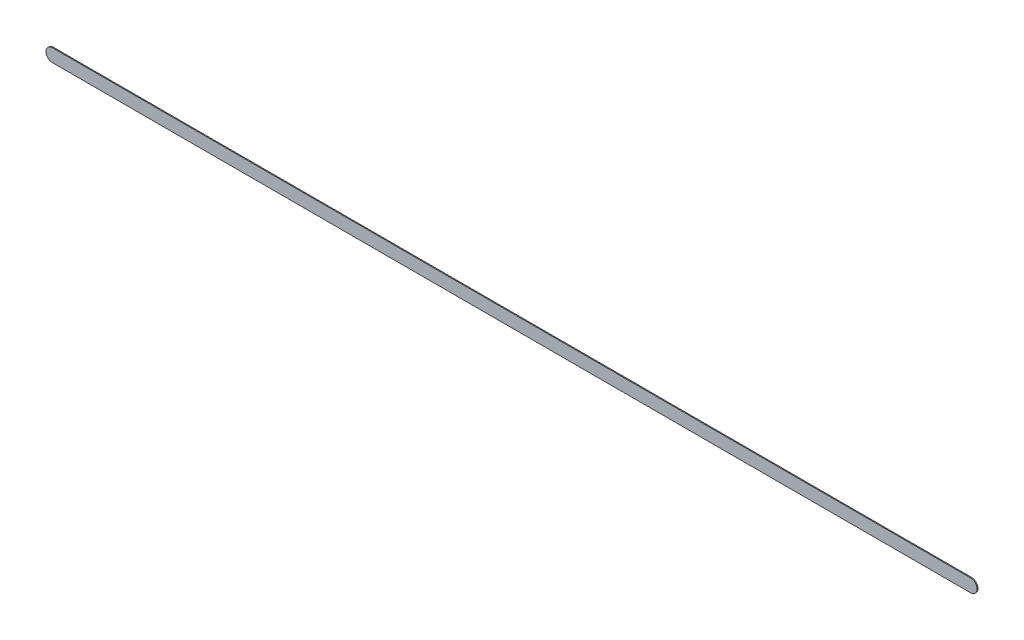
ISO-10303-21;
HEADER;
FILE_DESCRIPTION(('STEP AP214'),'2;1');
FILE_NAME('part.step','',(''),(''),'','','');
FILE_SCHEMA(('AUTOMOTIVE_DESIGN { 1 0 10303 214 1 1 1 1 }'));
ENDSEC;
DATA;
#1=APPLICATION_CONTEXT('core data for automotive mechanical design processes');
#2=APPLICATION_PROTOCOL_DEFINITION('international standard','automotive_design',2000,#1);
#3=PRODUCT_CONTEXT('',#1,'mechanical');
#4=PRODUCT('Part','Part','',(#3));
#5=PRODUCT_RELATED_PRODUCT_CATEGORY('part','',(#4));
#6=PRODUCT_DEFINITION_FORMATION('','',#4);
#7=PRODUCT_DEFINITION_CONTEXT('part definition',#1,'design');
#8=PRODUCT_DEFINITION('design','',#6,#7);
#9=PRODUCT_DEFINITION_SHAPE('','',#8);
#10=(LENGTH_UNIT() NAMED_UNIT(*) SI_UNIT(.MILLI.,.METRE.));
#11=(NAMED_UNIT(*) PLANE_ANGLE_UNIT() SI_UNIT($,.RADIAN.));
#12=(NAMED_UNIT(*) SI_UNIT($,.STERADIAN.) SOLID_ANGLE_UNIT());
#13=UNCERTAINTY_MEASURE_WITH_UNIT(LENGTH_MEASURE(1.E-05),#10,'distance_accuracy_value','');
#14=(GEOMETRIC_REPRESENTATION_CONTEXT(3) GLOBAL_UNCERTAINTY_ASSIGNED_CONTEXT((#13)) GLOBAL_UNIT_ASSIGNED_CONTEXT((#10,
#11,#12)) REPRESENTATION_CONTEXT('',''));
#15=CARTESIAN_POINT('',(0.,0.,0.));
#16=DIRECTION('',(0.,0.,1.));
#17=DIRECTION('',(1.,0.,0.));
#18=AXIS2_PLACEMENT_3D('',#15,#16,#17);
#19=CARTESIAN_POINT('',(74.40000106,61.75000096,0.));
#20=DIRECTION('',(0.,1.,0.));
#21=DIRECTION('',(1.,0.,0.));
#22=AXIS2_PLACEMENT_3D('',#19,#20,#21);
#23=PLANE('',#22);
#24=DIRECTION('',(1.,0.,0.));
#25=VECTOR('',#24,1.);
#26=CARTESIAN_POINT('',(74.40000106,61.75000096,0.03556));
#27=LINE('',#26,#25);
#28=CARTESIAN_POINT('',(74.40000106,61.75000096,0.03556));
#29=VERTEX_POINT('',#28);
#30=CARTESIAN_POINT('',(109.90000118,61.75000096,0.03556));
#31=VERTEX_POINT('',#30);
#32=EDGE_CURVE('E11',#29,#31,#27,.T.);
#33=ORIENTED_EDGE('',*,*,#32,.F.);
#34=DIRECTION('',(0.,0.,1.));
#35=VECTOR('',#34,1.);
#36=CARTESIAN_POINT('',(74.40000106,61.75000096,0.));
#37=LINE('',#36,#35);
#38=CARTESIAN_POINT('',(74.40000106,61.75000096,0.));
#39=VERTEX_POINT('',#38);
#40=EDGE_CURVE('E24',#39,#29,#37,.T.);
#41=ORIENTED_EDGE('',*,*,#40,.F.);
#42=DIRECTION('',(1.,0.,0.));
#43=VECTOR('',#42,1.);
#44=CARTESIAN_POINT('',(74.40000106,61.75000096,0.));
#45=LINE('',#44,#43);
#46=CARTESIAN_POINT('',(109.90000118,61.75000096,0.));
#47=VERTEX_POINT('',#46);
#48=EDGE_CURVE('E75',#39,#47,#45,.T.);
#49=ORIENTED_EDGE('',*,*,#48,.T.);
#50=DIRECTION('',(0.,0.,1.));
#51=VECTOR('',#50,1.);
#52=CARTESIAN_POINT('',(109.90000118,61.75000096,0.));
#53=LINE('',#52,#51);
#54=EDGE_CURVE('E37',#47,#31,#53,.T.);
#55=ORIENTED_EDGE('',*,*,#54,.T.);
#56=EDGE_LOOP('',(#33,#41,#49,#55));
#57=FACE_BOUND('',#56,.T.);
#58=ADVANCED_FACE('F17',(#57),#23,.F.);
#59=CARTESIAN_POINT('',(109.90000118,62.00000046,0.));
#60=DIRECTION('',(0.,0.,-1.));
#61=DIRECTION('',(0.,-1.,0.));
#62=AXIS2_PLACEMENT_3D('',#59,#60,#61);
#63=CYLINDRICAL_SURFACE('',#62,0.249999499999994);
#64=CARTESIAN_POINT('',(109.90000118,62.00000046,0.03556));
#65=DIRECTION('',(0.,0.,1.));
#66=DIRECTION('',(0.,-1.,0.));
#67=AXIS2_PLACEMENT_3D('',#64,#65,#66);
#68=CIRCLE('',#67,0.249999499999994);
#69=CARTESIAN_POINT('',(109.90000118,62.24999996,0.03556));
#70=VERTEX_POINT('',#69);
#71=EDGE_CURVE('E83',#31,#70,#68,.T.);
#72=ORIENTED_EDGE('',*,*,#71,.F.);
#73=ORIENTED_EDGE('',*,*,#54,.F.);
#74=CARTESIAN_POINT('',(109.90000118,62.00000046,0.));
#75=DIRECTION('',(0.,0.,1.));
#76=DIRECTION('',(0.,-1.,0.));
#77=AXIS2_PLACEMENT_3D('',#74,#75,#76);
#78=CIRCLE('',#77,0.249999499999994);
#79=CARTESIAN_POINT('',(109.90000118,62.24999996,0.));
#80=VERTEX_POINT('',#79);
#81=EDGE_CURVE('E81',#47,#80,#78,.T.);
#82=ORIENTED_EDGE('',*,*,#81,.T.);
#83=DIRECTION('',(0.,0.,1.));
#84=VECTOR('',#83,1.);
#85=CARTESIAN_POINT('',(109.90000118,62.24999996,0.));
#86=LINE('',#85,#84);
#87=EDGE_CURVE('E67',#80,#70,#86,.T.);
#88=ORIENTED_EDGE('',*,*,#87,.T.);
#89=EDGE_LOOP('',(#72,#73,#82,#88));
#90=FACE_BOUND('',#89,.T.);
#91=ADVANCED_FACE('F89',(#90),#63,.T.);
#92=CARTESIAN_POINT('',(109.90000118,62.24999996,0.));
#93=DIRECTION('',(0.,-1.,0.));
#94=DIRECTION('',(-1.,0.,0.));
#95=AXIS2_PLACEMENT_3D('',#92,#93,#94);
#96=PLANE('',#95);
#97=DIRECTION('',(-1.,0.,0.));
#98=VECTOR('',#97,1.);
#99=CARTESIAN_POINT('',(109.90000118,62.24999996,0.03556));
#100=LINE('',#99,#98);
#101=CARTESIAN_POINT('',(74.40000106,62.24999996,0.03556));
#102=VERTEX_POINT('',#101);
#103=EDGE_CURVE('E71',#70,#102,#100,.T.);
#104=ORIENTED_EDGE('',*,*,#103,.F.);
#105=ORIENTED_EDGE('',*,*,#87,.F.);
#106=DIRECTION('',(-1.,0.,0.));
#107=VECTOR('',#106,1.);
#108=CARTESIAN_POINT('',(109.90000118,62.24999996,0.));
#109=LINE('',#108,#107);
#110=CARTESIAN_POINT('',(74.40000106,62.24999996,0.));
#111=VERTEX_POINT('',#110);
#112=EDGE_CURVE('E63',#80,#111,#109,.T.);
#113=ORIENTED_EDGE('',*,*,#112,.T.);
#114=DIRECTION('',(0.,0.,1.));
#115=VECTOR('',#114,1.);
#116=CARTESIAN_POINT('',(74.40000106,62.24999996,0.));
#117=LINE('',#116,#115);
#118=EDGE_CURVE('E53',#111,#102,#117,.T.);
#119=ORIENTED_EDGE('',*,*,#118,.T.);
#120=EDGE_LOOP('',(#104,#105,#113,#119));
#121=FACE_BOUND('',#120,.T.);
#122=ADVANCED_FACE('F66',(#121),#96,.F.);
#123=CARTESIAN_POINT('',(74.40000106,62.00000046,0.));
#124=DIRECTION('',(0.,0.,-1.));
#125=DIRECTION('',(0.,1.,0.));
#126=AXIS2_PLACEMENT_3D('',#123,#124,#125);
#127=CYLINDRICAL_SURFACE('',#126,0.249999499999999);
#128=CARTESIAN_POINT('',(74.40000106,62.00000046,0.03556));
#129=DIRECTION('',(0.,0.,1.));
#130=DIRECTION('',(0.,1.,0.));
#131=AXIS2_PLACEMENT_3D('',#128,#129,#130);
#132=CIRCLE('',#131,0.249999499999999);
#133=EDGE_CURVE('E59',#102,#29,#132,.T.);
#134=ORIENTED_EDGE('',*,*,#133,.F.);
#135=ORIENTED_EDGE('',*,*,#118,.F.);
#136=CARTESIAN_POINT('',(74.40000106,62.00000046,0.));
#137=DIRECTION('',(0.,0.,1.));
#138=DIRECTION('',(0.,1.,0.));
#139=AXIS2_PLACEMENT_3D('',#136,#137,#138);
#140=CIRCLE('',#139,0.249999499999999);
#141=EDGE_CURVE('E57',#111,#39,#140,.T.);
#142=ORIENTED_EDGE('',*,*,#141,.T.);
#143=ORIENTED_EDGE('',*,*,#40,.T.);
#144=EDGE_LOOP('',(#134,#135,#142,#143));
#145=FACE_BOUND('',#144,.T.);
#146=ADVANCED_FACE('F55',(#145),#127,.T.);
#147=CARTESIAN_POINT('',(74.40000106,61.75000096,0.));
#148=DIRECTION('',(0.,0.,-1.));
#149=DIRECTION('',(-1.,0.,0.));
#150=AXIS2_PLACEMENT_3D('',#147,#148,#149);
#151=PLANE('',#150);
#152=ORIENTED_EDGE('',*,*,#141,.F.);
#153=ORIENTED_EDGE('',*,*,#112,.F.);
#154=ORIENTED_EDGE('',*,*,#81,.F.);
#155=ORIENTED_EDGE('',*,*,#48,.F.);
#156=EDGE_LOOP('',(#152,#153,#154,#155));
#157=FACE_BOUND('',#156,.T.);
#158=ADVANCED_FACE('F74',(#157),#151,.T.);
#159=CARTESIAN_POINT('',(74.40000106,61.75000096,0.03556));
#160=DIRECTION('',(0.,0.,-1.));
#161=DIRECTION('',(-1.,0.,0.));
#162=AXIS2_PLACEMENT_3D('',#159,#160,#161);
#163=PLANE('',#162);
#164=ORIENTED_EDGE('',*,*,#32,.T.);
#165=ORIENTED_EDGE('',*,*,#71,.T.);
#166=ORIENTED_EDGE('',*,*,#103,.T.);
#167=ORIENTED_EDGE('',*,*,#133,.T.);
#168=EDGE_LOOP('',(#164,#165,#166,#167));
#169=FACE_BOUND('',#168,.T.);
#170=ADVANCED_FACE('F91',(#169),#163,.F.);
#171=CLOSED_SHELL('',(#58,#91,#122,#146,#158,#170));
#172=MANIFOLD_SOLID_BREP('B1',#171);
#173=ADVANCED_BREP_SHAPE_REPRESENTATION('',(#18,#172),#14);
#174=SHAPE_DEFINITION_REPRESENTATION(#9,#173);
ENDSEC;
END-ISO-10303-21;
